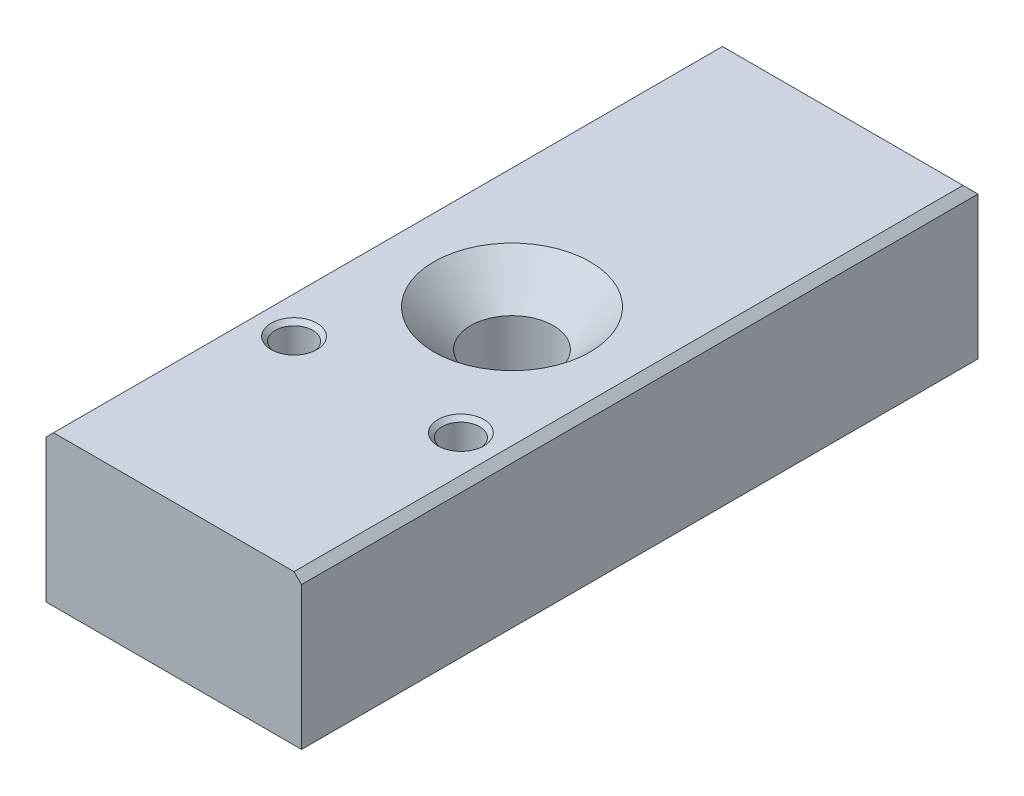
ISO-10303-21;
HEADER;
FILE_DESCRIPTION(('STEP AP214'),'2;1');
FILE_NAME('part.step','',(''),(''),'','','');
FILE_SCHEMA(('AUTOMOTIVE_DESIGN { 1 0 10303 214 1 1 1 1 }'));
ENDSEC;
DATA;
#1=APPLICATION_CONTEXT('core data for automotive mechanical design processes');
#2=APPLICATION_PROTOCOL_DEFINITION('international standard','automotive_design',2000,#1);
#3=PRODUCT_CONTEXT('',#1,'mechanical');
#4=PRODUCT('Part','Part','',(#3));
#5=PRODUCT_RELATED_PRODUCT_CATEGORY('part','',(#4));
#6=PRODUCT_DEFINITION_FORMATION('','',#4);
#7=PRODUCT_DEFINITION_CONTEXT('part definition',#1,'design');
#8=PRODUCT_DEFINITION('design','',#6,#7);
#9=PRODUCT_DEFINITION_SHAPE('','',#8);
#10=(LENGTH_UNIT() NAMED_UNIT(*) SI_UNIT(.MILLI.,.METRE.));
#11=(NAMED_UNIT(*) PLANE_ANGLE_UNIT() SI_UNIT($,.RADIAN.));
#12=(NAMED_UNIT(*) SI_UNIT($,.STERADIAN.) SOLID_ANGLE_UNIT());
#13=UNCERTAINTY_MEASURE_WITH_UNIT(LENGTH_MEASURE(1.E-05),#10,'distance_accuracy_value','');
#14=(GEOMETRIC_REPRESENTATION_CONTEXT(3) GLOBAL_UNCERTAINTY_ASSIGNED_CONTEXT((#13)) GLOBAL_UNIT_ASSIGNED_CONTEXT((#10,
#11,#12)) REPRESENTATION_CONTEXT('',''));
#15=CARTESIAN_POINT('',(0.,0.,0.));
#16=DIRECTION('',(0.,0.,1.));
#17=DIRECTION('',(1.,0.,0.));
#18=AXIS2_PLACEMENT_3D('',#15,#16,#17);
#19=CARTESIAN_POINT('',(8.5,10.,-22.5));
#20=DIRECTION('',(-1.,0.,0.));
#21=DIRECTION('',(0.,0.,1.));
#22=AXIS2_PLACEMENT_3D('',#19,#20,#21);
#23=PLANE('',#22);
#24=DIRECTION('',(0.,-1.,0.));
#25=VECTOR('',#24,1.);
#26=CARTESIAN_POINT('',(8.5,10.,-22.5));
#27=LINE('',#26,#25);
#28=CARTESIAN_POINT('',(8.5,9.5,-22.5));
#29=VERTEX_POINT('',#28);
#30=CARTESIAN_POINT('',(8.5,0.,-22.5));
#31=VERTEX_POINT('',#30);
#32=EDGE_CURVE('E96',#29,#31,#27,.T.);
#33=ORIENTED_EDGE('',*,*,#32,.F.);
#34=DIRECTION('',(0.,0.,1.));
#35=VECTOR('',#34,1.);
#36=CARTESIAN_POINT('',(8.5,9.5,22.5));
#37=LINE('',#36,#35);
#38=CARTESIAN_POINT('',(8.5,9.5,22.5));
#39=VERTEX_POINT('',#38);
#40=EDGE_CURVE('E152',#29,#39,#37,.T.);
#41=ORIENTED_EDGE('',*,*,#40,.T.);
#42=DIRECTION('',(0.,-1.,0.));
#43=VECTOR('',#42,1.);
#44=CARTESIAN_POINT('',(8.5,10.,22.5));
#45=LINE('',#44,#43);
#46=CARTESIAN_POINT('',(8.5,0.,22.5));
#47=VERTEX_POINT('',#46);
#48=EDGE_CURVE('E119',#39,#47,#45,.T.);
#49=ORIENTED_EDGE('',*,*,#48,.T.);
#50=DIRECTION('',(0.,0.,-1.));
#51=VECTOR('',#50,1.);
#52=CARTESIAN_POINT('',(8.5,0.,-22.5));
#53=LINE('',#52,#51);
#54=EDGE_CURVE('E113',#47,#31,#53,.T.);
#55=ORIENTED_EDGE('',*,*,#54,.T.);
#56=EDGE_LOOP('',(#33,#41,#49,#55));
#57=FACE_BOUND('',#56,.T.);
#58=ADVANCED_FACE('F41',(#57),#23,.F.);
#59=CARTESIAN_POINT('',(-8.5,10.,-22.5));
#60=DIRECTION('',(0.,0.,1.));
#61=DIRECTION('',(1.,0.,0.));
#62=AXIS2_PLACEMENT_3D('',#59,#60,#61);
#63=PLANE('',#62);
#64=DIRECTION('',(0.,-1.,0.));
#65=VECTOR('',#64,1.);
#66=CARTESIAN_POINT('',(-8.5,10.,-22.5));
#67=LINE('',#66,#65);
#68=CARTESIAN_POINT('',(-8.5,9.5,-22.5));
#69=VERTEX_POINT('',#68);
#70=CARTESIAN_POINT('',(-8.5,0.,-22.5));
#71=VERTEX_POINT('',#70);
#72=EDGE_CURVE('E107',#69,#71,#67,.T.);
#73=ORIENTED_EDGE('',*,*,#72,.F.);
#74=DIRECTION('',(1.,0.,0.));
#75=VECTOR('',#74,1.);
#76=CARTESIAN_POINT('',(8.5,9.5,-22.5));
#77=LINE('',#76,#75);
#78=EDGE_CURVE('E51',#69,#29,#77,.T.);
#79=ORIENTED_EDGE('',*,*,#78,.T.);
#80=ORIENTED_EDGE('',*,*,#32,.T.);
#81=DIRECTION('',(-1.,0.,0.));
#82=VECTOR('',#81,1.);
#83=CARTESIAN_POINT('',(-8.5,0.,-22.5));
#84=LINE('',#83,#82);
#85=EDGE_CURVE('E99',#31,#71,#84,.T.);
#86=ORIENTED_EDGE('',*,*,#85,.T.);
#87=EDGE_LOOP('',(#73,#79,#80,#86));
#88=FACE_BOUND('',#87,.T.);
#89=ADVANCED_FACE('F98',(#88),#63,.F.);
#90=CARTESIAN_POINT('',(-8.5,10.,-22.5));
#91=DIRECTION('',(1.,0.,0.));
#92=DIRECTION('',(0.,0.,-1.));
#93=AXIS2_PLACEMENT_3D('',#90,#91,#92);
#94=PLANE('',#93);
#95=DIRECTION('',(0.,-1.,0.));
#96=VECTOR('',#95,1.);
#97=CARTESIAN_POINT('',(-8.5,10.,22.5));
#98=LINE('',#97,#96);
#99=CARTESIAN_POINT('',(-8.5,9.5,22.5));
#100=VERTEX_POINT('',#99);
#101=CARTESIAN_POINT('',(-8.5,0.,22.5));
#102=VERTEX_POINT('',#101);
#103=EDGE_CURVE('E138',#100,#102,#98,.T.);
#104=ORIENTED_EDGE('',*,*,#103,.F.);
#105=DIRECTION('',(0.,0.,-1.));
#106=VECTOR('',#105,1.);
#107=CARTESIAN_POINT('',(-8.5,9.5,-22.5));
#108=LINE('',#107,#106);
#109=EDGE_CURVE('E11',#100,#69,#108,.T.);
#110=ORIENTED_EDGE('',*,*,#109,.T.);
#111=ORIENTED_EDGE('',*,*,#72,.T.);
#112=DIRECTION('',(0.,0.,1.));
#113=VECTOR('',#112,1.);
#114=CARTESIAN_POINT('',(-8.5,0.,-22.5));
#115=LINE('',#114,#113);
#116=EDGE_CURVE('E115',#71,#102,#115,.T.);
#117=ORIENTED_EDGE('',*,*,#116,.T.);
#118=EDGE_LOOP('',(#104,#110,#111,#117));
#119=FACE_BOUND('',#118,.T.);
#120=ADVANCED_FACE('F226',(#119),#94,.F.);
#121=CARTESIAN_POINT('',(-8.5,10.,22.5));
#122=DIRECTION('',(0.,0.,-1.));
#123=DIRECTION('',(-1.,0.,0.));
#124=AXIS2_PLACEMENT_3D('',#121,#122,#123);
#125=PLANE('',#124);
#126=ORIENTED_EDGE('',*,*,#48,.F.);
#127=DIRECTION('',(-0.707106781186552,0.707106781186543,0.));
#128=VECTOR('',#127,1.);
#129=CARTESIAN_POINT('',(7.99999999999999,10.,22.5));
#130=LINE('',#129,#128);
#131=CARTESIAN_POINT('',(8.,10.,22.5));
#132=VERTEX_POINT('',#131);
#133=EDGE_CURVE('E157',#39,#132,#130,.T.);
#134=ORIENTED_EDGE('',*,*,#133,.T.);
#135=DIRECTION('',(1.,0.,0.));
#136=VECTOR('',#135,1.);
#137=CARTESIAN_POINT('',(-8.5,10.,22.5));
#138=LINE('',#137,#136);
#139=CARTESIAN_POINT('',(-7.99999999999999,10.,22.5));
#140=VERTEX_POINT('',#139);
#141=EDGE_CURVE('E129',#140,#132,#138,.T.);
#142=ORIENTED_EDGE('',*,*,#141,.F.);
#143=DIRECTION('',(-0.707106781186552,-0.707106781186543,0.));
#144=VECTOR('',#143,1.);
#145=CARTESIAN_POINT('',(-7.99999999999999,10.,22.5));
#146=LINE('',#145,#144);
#147=EDGE_CURVE('E65',#140,#100,#146,.T.);
#148=ORIENTED_EDGE('',*,*,#147,.T.);
#149=ORIENTED_EDGE('',*,*,#103,.T.);
#150=DIRECTION('',(1.,0.,0.));
#151=VECTOR('',#150,1.);
#152=CARTESIAN_POINT('',(-8.5,0.,22.5));
#153=LINE('',#152,#151);
#154=EDGE_CURVE('E133',#102,#47,#153,.T.);
#155=ORIENTED_EDGE('',*,*,#154,.T.);
#156=EDGE_LOOP('',(#126,#134,#142,#148,#149,#155));
#157=FACE_BOUND('',#156,.T.);
#158=ADVANCED_FACE('F218',(#157),#125,.F.);
#159=CARTESIAN_POINT('',(0.,10.,0.));
#160=DIRECTION('',(0.,1.,0.));
#161=DIRECTION('',(0.,0.,1.));
#162=AXIS2_PLACEMENT_3D('',#159,#160,#161);
#163=PLANE('',#162);
#164=CARTESIAN_POINT('',(-5.54999999999931,10.,8.94999999999997));
#165=DIRECTION('',(0.,1.,0.));
#166=DIRECTION('',(0.,0.,1.));
#167=AXIS2_PLACEMENT_3D('',#164,#165,#166);
#168=CIRCLE('',#167,1.525);
#169=CARTESIAN_POINT('',(-5.54999999999931,10.,10.475));
#170=VERTEX_POINT('',#169);
#171=EDGE_CURVE('E169',#170,#170,#168,.T.);
#172=ORIENTED_EDGE('',*,*,#171,.F.);
#173=EDGE_LOOP('',(#172));
#174=FACE_BOUND('',#173,.T.);
#175=CARTESIAN_POINT('',(5.54999999999931,10.,8.94999999999997));
#176=DIRECTION('',(0.,1.,0.));
#177=DIRECTION('',(0.,0.,1.));
#178=AXIS2_PLACEMENT_3D('',#175,#176,#177);
#179=CIRCLE('',#178,1.525);
#180=CARTESIAN_POINT('',(5.54999999999931,10.,10.475));
#181=VERTEX_POINT('',#180);
#182=EDGE_CURVE('E186',#181,#181,#179,.T.);
#183=ORIENTED_EDGE('',*,*,#182,.F.);
#184=EDGE_LOOP('',(#183));
#185=FACE_BOUND('',#184,.T.);
#186=CARTESIAN_POINT('',(0.,10.,0.));
#187=DIRECTION('',(0.,1.,0.));
#188=DIRECTION('',(0.,0.,1.));
#189=AXIS2_PLACEMENT_3D('',#186,#187,#188);
#190=CIRCLE('',#189,5.2);
#191=CARTESIAN_POINT('',(0.,10.,5.2));
#192=VERTEX_POINT('',#191);
#193=EDGE_CURVE('E198',#192,#192,#190,.T.);
#194=ORIENTED_EDGE('',*,*,#193,.F.);
#195=EDGE_LOOP('',(#194));
#196=FACE_BOUND('',#195,.T.);
#197=ORIENTED_EDGE('',*,*,#141,.T.);
#198=DIRECTION('',(0.,0.,-1.));
#199=VECTOR('',#198,1.);
#200=CARTESIAN_POINT('',(7.99999999999999,10.,-22.5));
#201=LINE('',#200,#199);
#202=CARTESIAN_POINT('',(7.99999999999999,10.,-22.));
#203=VERTEX_POINT('',#202);
#204=EDGE_CURVE('E148',#132,#203,#201,.T.);
#205=ORIENTED_EDGE('',*,*,#204,.T.);
#206=DIRECTION('',(-1.,0.,0.));
#207=VECTOR('',#206,1.);
#208=CARTESIAN_POINT('',(-8.5,10.,-22.));
#209=LINE('',#208,#207);
#210=CARTESIAN_POINT('',(-8.,10.,-22.));
#211=VERTEX_POINT('',#210);
#212=EDGE_CURVE('E145',#203,#211,#209,.T.);
#213=ORIENTED_EDGE('',*,*,#212,.T.);
#214=DIRECTION('',(0.,0.,1.));
#215=VECTOR('',#214,1.);
#216=CARTESIAN_POINT('',(-7.99999999999999,10.,22.5));
#217=LINE('',#216,#215);
#218=EDGE_CURVE('E106',#211,#140,#217,.T.);
#219=ORIENTED_EDGE('',*,*,#218,.T.);
#220=EDGE_LOOP('',(#197,#205,#213,#219));
#221=FACE_BOUND('',#220,.T.);
#222=ADVANCED_FACE('F215',(#174,#185,#196,#221),#163,.T.);
#223=CARTESIAN_POINT('',(0.,0.,0.));
#224=DIRECTION('',(0.,1.,0.));
#225=DIRECTION('',(0.,0.,1.));
#226=AXIS2_PLACEMENT_3D('',#223,#224,#225);
#227=PLANE('',#226);
#228=CARTESIAN_POINT('',(-5.54999999999931,0.,8.94999999999997));
#229=DIRECTION('',(0.,1.,0.));
#230=DIRECTION('',(0.,0.,1.));
#231=AXIS2_PLACEMENT_3D('',#228,#229,#230);
#232=CIRCLE('',#231,1.25);
#233=CARTESIAN_POINT('',(-5.54999999999931,0.,10.2));
#234=VERTEX_POINT('',#233);
#235=EDGE_CURVE('E180',#234,#234,#232,.T.);
#236=ORIENTED_EDGE('',*,*,#235,.T.);
#237=EDGE_LOOP('',(#236));
#238=FACE_BOUND('',#237,.T.);
#239=CARTESIAN_POINT('',(5.54999999999931,0.,8.94999999999997));
#240=DIRECTION('',(0.,1.,0.));
#241=DIRECTION('',(0.,0.,1.));
#242=AXIS2_PLACEMENT_3D('',#239,#240,#241);
#243=CIRCLE('',#242,1.25);
#244=CARTESIAN_POINT('',(5.54999999999931,0.,10.2));
#245=VERTEX_POINT('',#244);
#246=EDGE_CURVE('E194',#245,#245,#243,.T.);
#247=ORIENTED_EDGE('',*,*,#246,.T.);
#248=EDGE_LOOP('',(#247));
#249=FACE_BOUND('',#248,.T.);
#250=CARTESIAN_POINT('',(0.,0.,0.));
#251=DIRECTION('',(0.,1.,0.));
#252=DIRECTION('',(0.,0.,1.));
#253=AXIS2_PLACEMENT_3D('',#250,#251,#252);
#254=CIRCLE('',#253,2.75);
#255=CARTESIAN_POINT('',(0.,0.,2.75));
#256=VERTEX_POINT('',#255);
#257=EDGE_CURVE('E122',#256,#256,#254,.T.);
#258=ORIENTED_EDGE('',*,*,#257,.T.);
#259=EDGE_LOOP('',(#258));
#260=FACE_BOUND('',#259,.T.);
#261=ORIENTED_EDGE('',*,*,#54,.F.);
#262=ORIENTED_EDGE('',*,*,#154,.F.);
#263=ORIENTED_EDGE('',*,*,#116,.F.);
#264=ORIENTED_EDGE('',*,*,#85,.F.);
#265=EDGE_LOOP('',(#261,#262,#263,#264));
#266=FACE_BOUND('',#265,.T.);
#267=ADVANCED_FACE('F111',(#238,#249,#260,#266),#227,.F.);
#268=CARTESIAN_POINT('',(0.,10.,0.));
#269=DIRECTION('',(0.,1.,0.));
#270=DIRECTION('',(0.,0.,1.));
#271=AXIS2_PLACEMENT_3D('',#268,#269,#270);
#272=CYLINDRICAL_SURFACE('',#271,2.74999999999999);
#273=ORIENTED_EDGE('',*,*,#257,.F.);
#274=EDGE_LOOP('',(#273));
#275=FACE_BOUND('',#274,.T.);
#276=CARTESIAN_POINT('',(0.,7.54999999999999,0.));
#277=DIRECTION('',(0.,1.,0.));
#278=DIRECTION('',(0.,0.,1.));
#279=AXIS2_PLACEMENT_3D('',#276,#277,#278);
#280=CIRCLE('',#279,2.74999999999999);
#281=CARTESIAN_POINT('',(0.,7.54999999999999,2.74999999999999));
#282=VERTEX_POINT('',#281);
#283=EDGE_CURVE('E126',#282,#282,#280,.T.);
#284=ORIENTED_EDGE('',*,*,#283,.T.);
#285=EDGE_LOOP('',(#284));
#286=FACE_BOUND('',#285,.T.);
#287=ADVANCED_FACE('F206',(#275,#286),#272,.F.);
#288=CARTESIAN_POINT('',(0.,10.,0.));
#289=DIRECTION('',(0.,1.,0.));
#290=DIRECTION('',(0.,0.,1.));
#291=AXIS2_PLACEMENT_3D('',#288,#289,#290);
#292=CONICAL_SURFACE('',#291,5.2,0.785398163397449);
#293=ORIENTED_EDGE('',*,*,#283,.F.);
#294=EDGE_LOOP('',(#293));
#295=FACE_BOUND('',#294,.T.);
#296=ORIENTED_EDGE('',*,*,#193,.T.);
#297=EDGE_LOOP('',(#296));
#298=FACE_BOUND('',#297,.T.);
#299=ADVANCED_FACE('F208',(#295,#298),#292,.F.);
#300=CARTESIAN_POINT('',(5.54999999999931,10.,8.94999999999997));
#301=DIRECTION('',(0.,1.,0.));
#302=DIRECTION('',(0.,0.,1.));
#303=AXIS2_PLACEMENT_3D('',#300,#301,#302);
#304=CYLINDRICAL_SURFACE('',#303,1.25);
#305=ORIENTED_EDGE('',*,*,#246,.F.);
#306=EDGE_LOOP('',(#305));
#307=FACE_BOUND('',#306,.T.);
#308=CARTESIAN_POINT('',(5.54999999999931,9.725,8.94999999999997));
#309=DIRECTION('',(0.,1.,0.));
#310=DIRECTION('',(0.,0.,1.));
#311=AXIS2_PLACEMENT_3D('',#308,#309,#310);
#312=CIRCLE('',#311,1.25);
#313=CARTESIAN_POINT('',(5.54999999999931,9.725,10.2));
#314=VERTEX_POINT('',#313);
#315=EDGE_CURVE('E190',#314,#314,#312,.T.);
#316=ORIENTED_EDGE('',*,*,#315,.T.);
#317=EDGE_LOOP('',(#316));
#318=FACE_BOUND('',#317,.T.);
#319=ADVANCED_FACE('F211',(#307,#318),#304,.F.);
#320=CARTESIAN_POINT('',(5.54999999999931,10.,8.94999999999997));
#321=DIRECTION('',(0.,1.,0.));
#322=DIRECTION('',(0.,0.,1.));
#323=AXIS2_PLACEMENT_3D('',#320,#321,#322);
#324=CONICAL_SURFACE('',#323,1.525,0.785398163397451);
#325=ORIENTED_EDGE('',*,*,#315,.F.);
#326=EDGE_LOOP('',(#325));
#327=FACE_BOUND('',#326,.T.);
#328=ORIENTED_EDGE('',*,*,#182,.T.);
#329=EDGE_LOOP('',(#328));
#330=FACE_BOUND('',#329,.T.);
#331=ADVANCED_FACE('F255',(#327,#330),#324,.F.);
#332=CARTESIAN_POINT('',(-5.54999999999931,10.,8.94999999999997));
#333=DIRECTION('',(0.,1.,0.));
#334=DIRECTION('',(0.,0.,1.));
#335=AXIS2_PLACEMENT_3D('',#332,#333,#334);
#336=CYLINDRICAL_SURFACE('',#335,1.25);
#337=ORIENTED_EDGE('',*,*,#235,.F.);
#338=EDGE_LOOP('',(#337));
#339=FACE_BOUND('',#338,.T.);
#340=CARTESIAN_POINT('',(-5.54999999999931,9.725,8.94999999999997));
#341=DIRECTION('',(0.,1.,0.));
#342=DIRECTION('',(0.,0.,1.));
#343=AXIS2_PLACEMENT_3D('',#340,#341,#342);
#344=CIRCLE('',#343,1.25);
#345=CARTESIAN_POINT('',(-5.54999999999931,9.725,10.2));
#346=VERTEX_POINT('',#345);
#347=EDGE_CURVE('E174',#346,#346,#344,.T.);
#348=ORIENTED_EDGE('',*,*,#347,.T.);
#349=EDGE_LOOP('',(#348));
#350=FACE_BOUND('',#349,.T.);
#351=ADVANCED_FACE('F259',(#339,#350),#336,.F.);
#352=CARTESIAN_POINT('',(-5.54999999999931,10.,8.94999999999997));
#353=DIRECTION('',(0.,1.,0.));
#354=DIRECTION('',(0.,0.,1.));
#355=AXIS2_PLACEMENT_3D('',#352,#353,#354);
#356=CONICAL_SURFACE('',#355,1.525,0.785398163397451);
#357=ORIENTED_EDGE('',*,*,#347,.F.);
#358=EDGE_LOOP('',(#357));
#359=FACE_BOUND('',#358,.T.);
#360=ORIENTED_EDGE('',*,*,#171,.T.);
#361=EDGE_LOOP('',(#360));
#362=FACE_BOUND('',#361,.T.);
#363=ADVANCED_FACE('F235',(#359,#362),#356,.F.);
#364=CARTESIAN_POINT('',(-7.99999999999999,10.,0.));
#365=DIRECTION('',(-0.707106781186542,0.707106781186552,0.));
#366=DIRECTION('',(0.,0.,-1.));
#367=AXIS2_PLACEMENT_3D('',#364,#365,#366);
#368=PLANE('',#367);
#369=ORIENTED_EDGE('',*,*,#147,.F.);
#370=ORIENTED_EDGE('',*,*,#218,.F.);
#371=DIRECTION('',(-0.577350269189629,-0.57735026918962,-0.577350269189628));
#372=VECTOR('',#371,1.);
#373=CARTESIAN_POINT('',(-0.666666666666598,17.3333333333333,-14.6666666666666));
#374=LINE('',#373,#372);
#375=EDGE_CURVE('E45',#69,#211,#374,.F.);
#376=ORIENTED_EDGE('',*,*,#375,.F.);
#377=ORIENTED_EDGE('',*,*,#109,.F.);
#378=EDGE_LOOP('',(#369,#370,#376,#377));
#379=FACE_BOUND('',#378,.T.);
#380=ADVANCED_FACE('F43',(#379),#368,.T.);
#381=CARTESIAN_POINT('',(0.,10.,-22.));
#382=DIRECTION('',(0.,0.707106781186552,-0.707106781186542));
#383=DIRECTION('',(1.,0.,0.));
#384=AXIS2_PLACEMENT_3D('',#381,#382,#383);
#385=PLANE('',#384);
#386=ORIENTED_EDGE('',*,*,#375,.T.);
#387=ORIENTED_EDGE('',*,*,#212,.F.);
#388=DIRECTION('',(0.577350269189629,-0.577350269189621,-0.577350269189629));
#389=VECTOR('',#388,1.);
#390=CARTESIAN_POINT('',(5.3333333333333,12.6666666666667,-19.3333333333333));
#391=LINE('',#390,#389);
#392=EDGE_CURVE('E161',#29,#203,#391,.F.);
#393=ORIENTED_EDGE('',*,*,#392,.F.);
#394=ORIENTED_EDGE('',*,*,#78,.F.);
#395=EDGE_LOOP('',(#386,#387,#393,#394));
#396=FACE_BOUND('',#395,.T.);
#397=ADVANCED_FACE('F228',(#396),#385,.T.);
#398=CARTESIAN_POINT('',(7.99999999999999,10.,0.));
#399=DIRECTION('',(0.707106781186542,0.707106781186552,0.));
#400=DIRECTION('',(0.,0.,1.));
#401=AXIS2_PLACEMENT_3D('',#398,#399,#400);
#402=PLANE('',#401);
#403=ORIENTED_EDGE('',*,*,#133,.F.);
#404=ORIENTED_EDGE('',*,*,#40,.F.);
#405=ORIENTED_EDGE('',*,*,#392,.T.);
#406=ORIENTED_EDGE('',*,*,#204,.F.);
#407=EDGE_LOOP('',(#403,#404,#405,#406));
#408=FACE_BOUND('',#407,.T.);
#409=ADVANCED_FACE('F225',(#408),#402,.T.);
#410=CLOSED_SHELL('',(#58,#89,#120,#158,#222,#267,#287,#299,#319,#331,#351,#363,#380,#397,#409));
#411=MANIFOLD_SOLID_BREP('B2',#410);
#412=ADVANCED_BREP_SHAPE_REPRESENTATION('',(#18,#411),#14);
#413=SHAPE_DEFINITION_REPRESENTATION(#9,#412);
ENDSEC;
END-ISO-10303-21;
